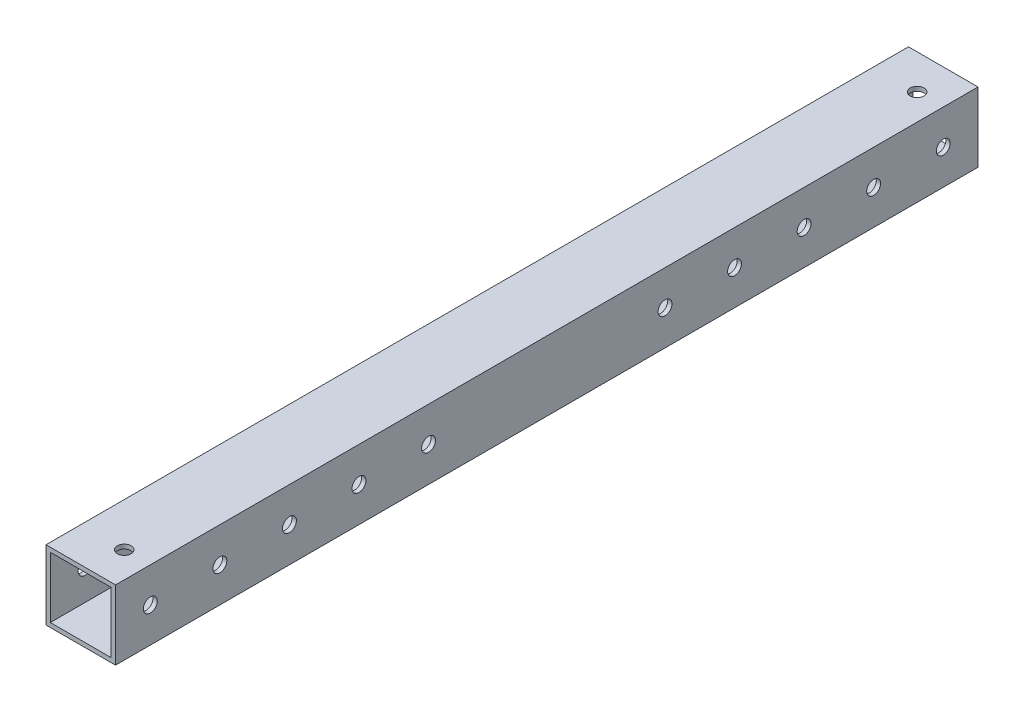
ISO-10303-21;
HEADER;
FILE_DESCRIPTION(('STEP AP214'),'2;1');
FILE_NAME('part.step','',(''),(''),'','','');
FILE_SCHEMA(('AUTOMOTIVE_DESIGN { 1 0 10303 214 1 1 1 1 }'));
ENDSEC;
DATA;
#1=APPLICATION_CONTEXT('core data for automotive mechanical design processes');
#2=APPLICATION_PROTOCOL_DEFINITION('international standard','automotive_design',2000,#1);
#3=PRODUCT_CONTEXT('',#1,'mechanical');
#4=PRODUCT('Part','Part','',(#3));
#5=PRODUCT_RELATED_PRODUCT_CATEGORY('part','',(#4));
#6=PRODUCT_DEFINITION_FORMATION('','',#4);
#7=PRODUCT_DEFINITION_CONTEXT('part definition',#1,'design');
#8=PRODUCT_DEFINITION('design','',#6,#7);
#9=PRODUCT_DEFINITION_SHAPE('','',#8);
#10=(LENGTH_UNIT() NAMED_UNIT(*) SI_UNIT(.MILLI.,.METRE.));
#11=(NAMED_UNIT(*) PLANE_ANGLE_UNIT() SI_UNIT($,.RADIAN.));
#12=(NAMED_UNIT(*) SI_UNIT($,.STERADIAN.) SOLID_ANGLE_UNIT());
#13=UNCERTAINTY_MEASURE_WITH_UNIT(LENGTH_MEASURE(1.E-05),#10,'distance_accuracy_value','');
#14=(GEOMETRIC_REPRESENTATION_CONTEXT(3) GLOBAL_UNCERTAINTY_ASSIGNED_CONTEXT((#13)) GLOBAL_UNIT_ASSIGNED_CONTEXT((#10,
#11,#12)) REPRESENTATION_CONTEXT('',''));
#15=CARTESIAN_POINT('',(0.,0.,0.));
#16=DIRECTION('',(0.,0.,1.));
#17=DIRECTION('',(1.,0.,0.));
#18=AXIS2_PLACEMENT_3D('',#15,#16,#17);
#19=CARTESIAN_POINT('',(0.,0.,314.96));
#20=DIRECTION('',(0.,0.,-1.));
#21=DIRECTION('',(-1.,0.,0.));
#22=AXIS2_PLACEMENT_3D('',#19,#20,#21);
#23=PLANE('',#22);
#24=DIRECTION('',(0.,-1.,0.));
#25=VECTOR('',#24,1.);
#26=CARTESIAN_POINT('',(0.,0.,314.96));
#27=LINE('',#26,#25);
#28=CARTESIAN_POINT('',(0.,25.4,314.96));
#29=VERTEX_POINT('',#28);
#30=CARTESIAN_POINT('',(0.,0.,314.96));
#31=VERTEX_POINT('',#30);
#32=EDGE_CURVE('E139',#29,#31,#27,.T.);
#33=ORIENTED_EDGE('',*,*,#32,.T.);
#34=DIRECTION('',(1.,0.,0.));
#35=VECTOR('',#34,1.);
#36=CARTESIAN_POINT('',(0.,0.,314.96));
#37=LINE('',#36,#35);
#38=CARTESIAN_POINT('',(25.4,0.,314.96));
#39=VERTEX_POINT('',#38);
#40=EDGE_CURVE('E142',#31,#39,#37,.T.);
#41=ORIENTED_EDGE('',*,*,#40,.T.);
#42=DIRECTION('',(0.,1.,0.));
#43=VECTOR('',#42,1.);
#44=CARTESIAN_POINT('',(25.4,0.,314.96));
#45=LINE('',#44,#43);
#46=CARTESIAN_POINT('',(25.4,25.4,314.96));
#47=VERTEX_POINT('',#46);
#48=EDGE_CURVE('E145',#39,#47,#45,.T.);
#49=ORIENTED_EDGE('',*,*,#48,.T.);
#50=DIRECTION('',(-1.,0.,0.));
#51=VECTOR('',#50,1.);
#52=CARTESIAN_POINT('',(0.,25.4,314.96));
#53=LINE('',#52,#51);
#54=EDGE_CURVE('E147',#47,#29,#53,.T.);
#55=ORIENTED_EDGE('',*,*,#54,.T.);
#56=EDGE_LOOP('',(#33,#41,#49,#55));
#57=FACE_BOUND('',#56,.T.);
#58=DIRECTION('',(0.,-1.,0.));
#59=VECTOR('',#58,1.);
#60=CARTESIAN_POINT('',(1.5875,1.5875,314.96));
#61=LINE('',#60,#59);
#62=CARTESIAN_POINT('',(1.5875,23.8125,314.96));
#63=VERTEX_POINT('',#62);
#64=CARTESIAN_POINT('',(1.5875,1.5875,314.96));
#65=VERTEX_POINT('',#64);
#66=EDGE_CURVE('E101',#63,#65,#61,.T.);
#67=ORIENTED_EDGE('',*,*,#66,.F.);
#68=DIRECTION('',(-1.,0.,0.));
#69=VECTOR('',#68,1.);
#70=CARTESIAN_POINT('',(1.5875,23.8125,314.96));
#71=LINE('',#70,#69);
#72=CARTESIAN_POINT('',(23.8125,23.8125,314.96));
#73=VERTEX_POINT('',#72);
#74=EDGE_CURVE('E123',#73,#63,#71,.T.);
#75=ORIENTED_EDGE('',*,*,#74,.F.);
#76=DIRECTION('',(0.,1.,0.));
#77=VECTOR('',#76,1.);
#78=CARTESIAN_POINT('',(23.8125,1.5875,314.96));
#79=LINE('',#78,#77);
#80=CARTESIAN_POINT('',(23.8125,1.5875,314.96));
#81=VERTEX_POINT('',#80);
#82=EDGE_CURVE('E121',#81,#73,#79,.T.);
#83=ORIENTED_EDGE('',*,*,#82,.F.);
#84=DIRECTION('',(1.,0.,0.));
#85=VECTOR('',#84,1.);
#86=CARTESIAN_POINT('',(1.5875,1.5875,314.96));
#87=LINE('',#86,#85);
#88=EDGE_CURVE('E109',#65,#81,#87,.T.);
#89=ORIENTED_EDGE('',*,*,#88,.F.);
#90=EDGE_LOOP('',(#67,#75,#83,#89));
#91=FACE_BOUND('',#90,.T.);
#92=ADVANCED_FACE('F34',(#57,#91),#23,.F.);
#93=CARTESIAN_POINT('',(0.,0.,0.));
#94=DIRECTION('',(0.,0.,-1.));
#95=DIRECTION('',(-1.,0.,0.));
#96=AXIS2_PLACEMENT_3D('',#93,#94,#95);
#97=PLANE('',#96);
#98=DIRECTION('',(0.,-1.,0.));
#99=VECTOR('',#98,1.);
#100=CARTESIAN_POINT('',(0.,0.,0.));
#101=LINE('',#100,#99);
#102=CARTESIAN_POINT('',(0.,25.4,0.));
#103=VERTEX_POINT('',#102);
#104=CARTESIAN_POINT('',(0.,0.,0.));
#105=VERTEX_POINT('',#104);
#106=EDGE_CURVE('E117',#103,#105,#101,.T.);
#107=ORIENTED_EDGE('',*,*,#106,.F.);
#108=DIRECTION('',(-1.,0.,0.));
#109=VECTOR('',#108,1.);
#110=CARTESIAN_POINT('',(0.,25.4,0.));
#111=LINE('',#110,#109);
#112=CARTESIAN_POINT('',(25.4,25.4,0.));
#113=VERTEX_POINT('',#112);
#114=EDGE_CURVE('E143',#113,#103,#111,.T.);
#115=ORIENTED_EDGE('',*,*,#114,.F.);
#116=DIRECTION('',(0.,1.,0.));
#117=VECTOR('',#116,1.);
#118=CARTESIAN_POINT('',(25.4,0.,0.));
#119=LINE('',#118,#117);
#120=CARTESIAN_POINT('',(25.4,0.,0.));
#121=VERTEX_POINT('',#120);
#122=EDGE_CURVE('E154',#121,#113,#119,.T.);
#123=ORIENTED_EDGE('',*,*,#122,.F.);
#124=DIRECTION('',(1.,0.,0.));
#125=VECTOR('',#124,1.);
#126=CARTESIAN_POINT('',(0.,0.,0.));
#127=LINE('',#126,#125);
#128=EDGE_CURVE('E152',#105,#121,#127,.T.);
#129=ORIENTED_EDGE('',*,*,#128,.F.);
#130=EDGE_LOOP('',(#107,#115,#123,#129));
#131=FACE_BOUND('',#130,.T.);
#132=DIRECTION('',(-1.,0.,0.));
#133=VECTOR('',#132,1.);
#134=CARTESIAN_POINT('',(1.5875,23.8125,0.));
#135=LINE('',#134,#133);
#136=CARTESIAN_POINT('',(23.8125,23.8125,0.));
#137=VERTEX_POINT('',#136);
#138=CARTESIAN_POINT('',(1.5875,23.8125,0.));
#139=VERTEX_POINT('',#138);
#140=EDGE_CURVE('E110',#137,#139,#135,.T.);
#141=ORIENTED_EDGE('',*,*,#140,.T.);
#142=DIRECTION('',(0.,-1.,0.));
#143=VECTOR('',#142,1.);
#144=CARTESIAN_POINT('',(1.5875,1.5875,0.));
#145=LINE('',#144,#143);
#146=CARTESIAN_POINT('',(1.5875,1.5875,0.));
#147=VERTEX_POINT('',#146);
#148=EDGE_CURVE('E59',#139,#147,#145,.T.);
#149=ORIENTED_EDGE('',*,*,#148,.T.);
#150=DIRECTION('',(1.,0.,0.));
#151=VECTOR('',#150,1.);
#152=CARTESIAN_POINT('',(1.5875,1.5875,0.));
#153=LINE('',#152,#151);
#154=CARTESIAN_POINT('',(23.8125,1.5875,0.));
#155=VERTEX_POINT('',#154);
#156=EDGE_CURVE('E116',#147,#155,#153,.T.);
#157=ORIENTED_EDGE('',*,*,#156,.T.);
#158=DIRECTION('',(0.,1.,0.));
#159=VECTOR('',#158,1.);
#160=CARTESIAN_POINT('',(23.8125,1.5875,0.));
#161=LINE('',#160,#159);
#162=EDGE_CURVE('E131',#155,#137,#161,.T.);
#163=ORIENTED_EDGE('',*,*,#162,.T.);
#164=EDGE_LOOP('',(#141,#149,#157,#163));
#165=FACE_BOUND('',#164,.T.);
#166=ADVANCED_FACE('F267',(#131,#165),#97,.T.);
#167=CARTESIAN_POINT('',(0.,0.,314.96));
#168=DIRECTION('',(1.,0.,0.));
#169=DIRECTION('',(0.,0.,-1.));
#170=AXIS2_PLACEMENT_3D('',#167,#168,#169);
#171=PLANE('',#170);
#172=CARTESIAN_POINT('',(0.,12.7,302.26));
#173=DIRECTION('',(1.,0.,0.));
#174=DIRECTION('',(0.,0.,-1.));
#175=AXIS2_PLACEMENT_3D('',#172,#173,#174);
#176=CIRCLE('',#175,2.54000000000001);
#177=CARTESIAN_POINT('',(0.,12.7,299.72));
#178=VERTEX_POINT('',#177);
#179=EDGE_CURVE('E176',#178,#178,#176,.T.);
#180=ORIENTED_EDGE('',*,*,#179,.T.);
#181=EDGE_LOOP('',(#180));
#182=FACE_BOUND('',#181,.T.);
#183=CARTESIAN_POINT('',(0.,12.7,276.86));
#184=DIRECTION('',(1.,0.,0.));
#185=DIRECTION('',(0.,0.,-1.));
#186=AXIS2_PLACEMENT_3D('',#183,#184,#185);
#187=CIRCLE('',#186,2.54000000000001);
#188=CARTESIAN_POINT('',(0.,12.7,274.32));
#189=VERTEX_POINT('',#188);
#190=EDGE_CURVE('E384',#189,#189,#187,.T.);
#191=ORIENTED_EDGE('',*,*,#190,.T.);
#192=EDGE_LOOP('',(#191));
#193=FACE_BOUND('',#192,.T.);
#194=CARTESIAN_POINT('',(0.,12.7,251.46));
#195=DIRECTION('',(1.,0.,0.));
#196=DIRECTION('',(0.,0.,-1.));
#197=AXIS2_PLACEMENT_3D('',#194,#195,#196);
#198=CIRCLE('',#197,2.53999999999995);
#199=CARTESIAN_POINT('',(0.,12.7,248.92));
#200=VERTEX_POINT('',#199);
#201=EDGE_CURVE('E388',#200,#200,#198,.T.);
#202=ORIENTED_EDGE('',*,*,#201,.T.);
#203=EDGE_LOOP('',(#202));
#204=FACE_BOUND('',#203,.T.);
#205=CARTESIAN_POINT('',(0.,12.7,226.06));
#206=DIRECTION('',(1.,0.,0.));
#207=DIRECTION('',(0.,0.,-1.));
#208=AXIS2_PLACEMENT_3D('',#205,#206,#207);
#209=CIRCLE('',#208,2.53999999999998);
#210=CARTESIAN_POINT('',(0.,12.7,223.52));
#211=VERTEX_POINT('',#210);
#212=EDGE_CURVE('E392',#211,#211,#209,.T.);
#213=ORIENTED_EDGE('',*,*,#212,.T.);
#214=EDGE_LOOP('',(#213));
#215=FACE_BOUND('',#214,.T.);
#216=CARTESIAN_POINT('',(0.,12.7,200.66));
#217=DIRECTION('',(1.,0.,0.));
#218=DIRECTION('',(0.,0.,-1.));
#219=AXIS2_PLACEMENT_3D('',#216,#217,#218);
#220=CIRCLE('',#219,2.53999999999998);
#221=CARTESIAN_POINT('',(0.,12.7,198.12));
#222=VERTEX_POINT('',#221);
#223=EDGE_CURVE('E396',#222,#222,#220,.T.);
#224=ORIENTED_EDGE('',*,*,#223,.T.);
#225=EDGE_LOOP('',(#224));
#226=FACE_BOUND('',#225,.T.);
#227=CARTESIAN_POINT('',(0.,12.7,114.3));
#228=DIRECTION('',(1.,0.,0.));
#229=DIRECTION('',(0.,0.,1.));
#230=AXIS2_PLACEMENT_3D('',#227,#228,#229);
#231=CIRCLE('',#230,2.53999999999998);
#232=CARTESIAN_POINT('',(0.,12.7,116.84));
#233=VERTEX_POINT('',#232);
#234=EDGE_CURVE('E400',#233,#233,#231,.T.);
#235=ORIENTED_EDGE('',*,*,#234,.T.);
#236=EDGE_LOOP('',(#235));
#237=FACE_BOUND('',#236,.T.);
#238=CARTESIAN_POINT('',(0.,12.7,88.9));
#239=DIRECTION('',(1.,0.,0.));
#240=DIRECTION('',(0.,0.,1.));
#241=AXIS2_PLACEMENT_3D('',#238,#239,#240);
#242=CIRCLE('',#241,2.53999999999998);
#243=CARTESIAN_POINT('',(0.,12.7,91.44));
#244=VERTEX_POINT('',#243);
#245=EDGE_CURVE('E404',#244,#244,#242,.T.);
#246=ORIENTED_EDGE('',*,*,#245,.T.);
#247=EDGE_LOOP('',(#246));
#248=FACE_BOUND('',#247,.T.);
#249=CARTESIAN_POINT('',(0.,12.7,63.5));
#250=DIRECTION('',(1.,0.,0.));
#251=DIRECTION('',(0.,0.,1.));
#252=AXIS2_PLACEMENT_3D('',#249,#250,#251);
#253=CIRCLE('',#252,2.53999999999996);
#254=CARTESIAN_POINT('',(0.,12.7,66.04));
#255=VERTEX_POINT('',#254);
#256=EDGE_CURVE('E408',#255,#255,#253,.T.);
#257=ORIENTED_EDGE('',*,*,#256,.T.);
#258=EDGE_LOOP('',(#257));
#259=FACE_BOUND('',#258,.T.);
#260=CARTESIAN_POINT('',(0.,12.7,38.1));
#261=DIRECTION('',(1.,0.,0.));
#262=DIRECTION('',(0.,0.,1.));
#263=AXIS2_PLACEMENT_3D('',#260,#261,#262);
#264=CIRCLE('',#263,2.53999999999998);
#265=CARTESIAN_POINT('',(0.,12.7,40.64));
#266=VERTEX_POINT('',#265);
#267=EDGE_CURVE('E411',#266,#266,#264,.T.);
#268=ORIENTED_EDGE('',*,*,#267,.T.);
#269=EDGE_LOOP('',(#268));
#270=FACE_BOUND('',#269,.T.);
#271=CARTESIAN_POINT('',(0.,12.7,12.7));
#272=DIRECTION('',(1.,0.,0.));
#273=DIRECTION('',(0.,0.,1.));
#274=AXIS2_PLACEMENT_3D('',#271,#272,#273);
#275=CIRCLE('',#274,2.53999999999998);
#276=CARTESIAN_POINT('',(0.,12.7,15.24));
#277=VERTEX_POINT('',#276);
#278=EDGE_CURVE('E331',#277,#277,#275,.T.);
#279=ORIENTED_EDGE('',*,*,#278,.T.);
#280=EDGE_LOOP('',(#279));
#281=FACE_BOUND('',#280,.T.);
#282=ORIENTED_EDGE('',*,*,#106,.T.);
#283=DIRECTION('',(0.,0.,-1.));
#284=VECTOR('',#283,1.);
#285=CARTESIAN_POINT('',(0.,0.,314.96));
#286=LINE('',#285,#284);
#287=EDGE_CURVE('E11',#31,#105,#286,.T.);
#288=ORIENTED_EDGE('',*,*,#287,.F.);
#289=ORIENTED_EDGE('',*,*,#32,.F.);
#290=DIRECTION('',(0.,0.,-1.));
#291=VECTOR('',#290,1.);
#292=CARTESIAN_POINT('',(0.,25.4,314.96));
#293=LINE('',#292,#291);
#294=EDGE_CURVE('E149',#29,#103,#293,.T.);
#295=ORIENTED_EDGE('',*,*,#294,.T.);
#296=EDGE_LOOP('',(#282,#288,#289,#295));
#297=FACE_BOUND('',#296,.T.);
#298=ADVANCED_FACE('F36',(#182,#193,#204,#215,#226,#237,#248,#259,#270,#281,#297),#171,.F.);
#299=CARTESIAN_POINT('',(0.,0.,314.96));
#300=DIRECTION('',(0.,1.,0.));
#301=DIRECTION('',(0.,0.,1.));
#302=AXIS2_PLACEMENT_3D('',#299,#300,#301);
#303=PLANE('',#302);
#304=CARTESIAN_POINT('',(15.875,0.,302.26));
#305=DIRECTION('',(0.,1.,0.));
#306=DIRECTION('',(0.,0.,1.));
#307=AXIS2_PLACEMENT_3D('',#304,#305,#306);
#308=CIRCLE('',#307,2.53999999999997);
#309=CARTESIAN_POINT('',(15.875,0.,304.8));
#310=VERTEX_POINT('',#309);
#311=EDGE_CURVE('E168',#310,#310,#308,.T.);
#312=ORIENTED_EDGE('',*,*,#311,.T.);
#313=EDGE_LOOP('',(#312));
#314=FACE_BOUND('',#313,.T.);
#315=CARTESIAN_POINT('',(15.875,0.,12.7));
#316=DIRECTION('',(0.,1.,0.));
#317=DIRECTION('',(0.,0.,1.));
#318=AXIS2_PLACEMENT_3D('',#315,#316,#317);
#319=CIRCLE('',#318,2.54);
#320=CARTESIAN_POINT('',(15.875,0.,15.24));
#321=VERTEX_POINT('',#320);
#322=EDGE_CURVE('E227',#321,#321,#319,.T.);
#323=ORIENTED_EDGE('',*,*,#322,.T.);
#324=EDGE_LOOP('',(#323));
#325=FACE_BOUND('',#324,.T.);
#326=ORIENTED_EDGE('',*,*,#128,.T.);
#327=DIRECTION('',(0.,0.,-1.));
#328=VECTOR('',#327,1.);
#329=CARTESIAN_POINT('',(25.4,0.,314.96));
#330=LINE('',#329,#328);
#331=EDGE_CURVE('E43',#39,#121,#330,.T.);
#332=ORIENTED_EDGE('',*,*,#331,.F.);
#333=ORIENTED_EDGE('',*,*,#40,.F.);
#334=ORIENTED_EDGE('',*,*,#287,.T.);
#335=EDGE_LOOP('',(#326,#332,#333,#334));
#336=FACE_BOUND('',#335,.T.);
#337=ADVANCED_FACE('F253',(#314,#325,#336),#303,.F.);
#338=CARTESIAN_POINT('',(25.4,0.,314.96));
#339=DIRECTION('',(-1.,0.,0.));
#340=DIRECTION('',(0.,0.,1.));
#341=AXIS2_PLACEMENT_3D('',#338,#339,#340);
#342=PLANE('',#341);
#343=CARTESIAN_POINT('',(25.4,12.7,302.26));
#344=DIRECTION('',(1.,0.,0.));
#345=DIRECTION('',(0.,0.,-1.));
#346=AXIS2_PLACEMENT_3D('',#343,#344,#345);
#347=CIRCLE('',#346,2.54000000000001);
#348=CARTESIAN_POINT('',(25.4,12.7,299.72));
#349=VERTEX_POINT('',#348);
#350=EDGE_CURVE('E294',#349,#349,#347,.T.);
#351=ORIENTED_EDGE('',*,*,#350,.F.);
#352=EDGE_LOOP('',(#351));
#353=FACE_BOUND('',#352,.T.);
#354=CARTESIAN_POINT('',(25.4,12.7,276.86));
#355=DIRECTION('',(1.,0.,0.));
#356=DIRECTION('',(0.,0.,-1.));
#357=AXIS2_PLACEMENT_3D('',#354,#355,#356);
#358=CIRCLE('',#357,2.54000000000001);
#359=CARTESIAN_POINT('',(25.4,12.7,274.32));
#360=VERTEX_POINT('',#359);
#361=EDGE_CURVE('E298',#360,#360,#358,.T.);
#362=ORIENTED_EDGE('',*,*,#361,.F.);
#363=EDGE_LOOP('',(#362));
#364=FACE_BOUND('',#363,.T.);
#365=CARTESIAN_POINT('',(25.4,12.7,251.46));
#366=DIRECTION('',(1.,0.,0.));
#367=DIRECTION('',(0.,0.,-1.));
#368=AXIS2_PLACEMENT_3D('',#365,#366,#367);
#369=CIRCLE('',#368,2.53999999999995);
#370=CARTESIAN_POINT('',(25.4,12.7,248.92));
#371=VERTEX_POINT('',#370);
#372=EDGE_CURVE('E302',#371,#371,#369,.T.);
#373=ORIENTED_EDGE('',*,*,#372,.F.);
#374=EDGE_LOOP('',(#373));
#375=FACE_BOUND('',#374,.T.);
#376=CARTESIAN_POINT('',(25.4,12.7,226.06));
#377=DIRECTION('',(1.,0.,0.));
#378=DIRECTION('',(0.,0.,-1.));
#379=AXIS2_PLACEMENT_3D('',#376,#377,#378);
#380=CIRCLE('',#379,2.53999999999998);
#381=CARTESIAN_POINT('',(25.4,12.7,223.52));
#382=VERTEX_POINT('',#381);
#383=EDGE_CURVE('E306',#382,#382,#380,.T.);
#384=ORIENTED_EDGE('',*,*,#383,.F.);
#385=EDGE_LOOP('',(#384));
#386=FACE_BOUND('',#385,.T.);
#387=CARTESIAN_POINT('',(25.4,12.7,200.66));
#388=DIRECTION('',(1.,0.,0.));
#389=DIRECTION('',(0.,0.,-1.));
#390=AXIS2_PLACEMENT_3D('',#387,#388,#389);
#391=CIRCLE('',#390,2.53999999999998);
#392=CARTESIAN_POINT('',(25.4,12.7,198.12));
#393=VERTEX_POINT('',#392);
#394=EDGE_CURVE('E310',#393,#393,#391,.T.);
#395=ORIENTED_EDGE('',*,*,#394,.F.);
#396=EDGE_LOOP('',(#395));
#397=FACE_BOUND('',#396,.T.);
#398=CARTESIAN_POINT('',(25.4,12.7,114.3));
#399=DIRECTION('',(1.,0.,0.));
#400=DIRECTION('',(0.,0.,1.));
#401=AXIS2_PLACEMENT_3D('',#398,#399,#400);
#402=CIRCLE('',#401,2.53999999999998);
#403=CARTESIAN_POINT('',(25.4,12.7,116.84));
#404=VERTEX_POINT('',#403);
#405=EDGE_CURVE('E314',#404,#404,#402,.T.);
#406=ORIENTED_EDGE('',*,*,#405,.F.);
#407=EDGE_LOOP('',(#406));
#408=FACE_BOUND('',#407,.T.);
#409=CARTESIAN_POINT('',(25.4,12.7,88.9));
#410=DIRECTION('',(1.,0.,0.));
#411=DIRECTION('',(0.,0.,1.));
#412=AXIS2_PLACEMENT_3D('',#409,#410,#411);
#413=CIRCLE('',#412,2.53999999999998);
#414=CARTESIAN_POINT('',(25.4,12.7,91.44));
#415=VERTEX_POINT('',#414);
#416=EDGE_CURVE('E318',#415,#415,#413,.T.);
#417=ORIENTED_EDGE('',*,*,#416,.F.);
#418=EDGE_LOOP('',(#417));
#419=FACE_BOUND('',#418,.T.);
#420=CARTESIAN_POINT('',(25.4,12.7,63.5));
#421=DIRECTION('',(1.,0.,0.));
#422=DIRECTION('',(0.,0.,1.));
#423=AXIS2_PLACEMENT_3D('',#420,#421,#422);
#424=CIRCLE('',#423,2.53999999999996);
#425=CARTESIAN_POINT('',(25.4,12.7,66.04));
#426=VERTEX_POINT('',#425);
#427=EDGE_CURVE('E322',#426,#426,#424,.T.);
#428=ORIENTED_EDGE('',*,*,#427,.F.);
#429=EDGE_LOOP('',(#428));
#430=FACE_BOUND('',#429,.T.);
#431=CARTESIAN_POINT('',(25.4,12.7,38.1));
#432=DIRECTION('',(1.,0.,0.));
#433=DIRECTION('',(0.,0.,1.));
#434=AXIS2_PLACEMENT_3D('',#431,#432,#433);
#435=CIRCLE('',#434,2.53999999999998);
#436=CARTESIAN_POINT('',(25.4,12.7,40.64));
#437=VERTEX_POINT('',#436);
#438=EDGE_CURVE('E326',#437,#437,#435,.T.);
#439=ORIENTED_EDGE('',*,*,#438,.F.);
#440=EDGE_LOOP('',(#439));
#441=FACE_BOUND('',#440,.T.);
#442=CARTESIAN_POINT('',(25.4,12.7,12.7));
#443=DIRECTION('',(1.,0.,0.));
#444=DIRECTION('',(0.,0.,1.));
#445=AXIS2_PLACEMENT_3D('',#442,#443,#444);
#446=CIRCLE('',#445,2.53999999999998);
#447=CARTESIAN_POINT('',(25.4,12.7,15.24));
#448=VERTEX_POINT('',#447);
#449=EDGE_CURVE('E329',#448,#448,#446,.T.);
#450=ORIENTED_EDGE('',*,*,#449,.F.);
#451=EDGE_LOOP('',(#450));
#452=FACE_BOUND('',#451,.T.);
#453=ORIENTED_EDGE('',*,*,#122,.T.);
#454=DIRECTION('',(0.,0.,-1.));
#455=VECTOR('',#454,1.);
#456=CARTESIAN_POINT('',(25.4,25.4,314.96));
#457=LINE('',#456,#455);
#458=EDGE_CURVE('E159',#47,#113,#457,.T.);
#459=ORIENTED_EDGE('',*,*,#458,.F.);
#460=ORIENTED_EDGE('',*,*,#48,.F.);
#461=ORIENTED_EDGE('',*,*,#331,.T.);
#462=EDGE_LOOP('',(#453,#459,#460,#461));
#463=FACE_BOUND('',#462,.T.);
#464=ADVANCED_FACE('F256',(#353,#364,#375,#386,#397,#408,#419,#430,#441,#452,#463),#342,.F.);
#465=CARTESIAN_POINT('',(0.,25.4,314.96));
#466=DIRECTION('',(0.,-1.,0.));
#467=DIRECTION('',(0.,0.,-1.));
#468=AXIS2_PLACEMENT_3D('',#465,#466,#467);
#469=PLANE('',#468);
#470=CARTESIAN_POINT('',(15.875,25.4,302.26));
#471=DIRECTION('',(0.,1.,0.));
#472=DIRECTION('',(0.,0.,1.));
#473=AXIS2_PLACEMENT_3D('',#470,#471,#472);
#474=CIRCLE('',#473,2.53999999999997);
#475=CARTESIAN_POINT('',(15.875,25.4,304.8));
#476=VERTEX_POINT('',#475);
#477=EDGE_CURVE('E224',#476,#476,#474,.T.);
#478=ORIENTED_EDGE('',*,*,#477,.F.);
#479=EDGE_LOOP('',(#478));
#480=FACE_BOUND('',#479,.T.);
#481=CARTESIAN_POINT('',(15.875,25.4,12.7));
#482=DIRECTION('',(0.,1.,0.));
#483=DIRECTION('',(0.,0.,1.));
#484=AXIS2_PLACEMENT_3D('',#481,#482,#483);
#485=CIRCLE('',#484,2.54);
#486=CARTESIAN_POINT('',(15.875,25.4,15.24));
#487=VERTEX_POINT('',#486);
#488=EDGE_CURVE('E221',#487,#487,#485,.T.);
#489=ORIENTED_EDGE('',*,*,#488,.F.);
#490=EDGE_LOOP('',(#489));
#491=FACE_BOUND('',#490,.T.);
#492=ORIENTED_EDGE('',*,*,#114,.T.);
#493=ORIENTED_EDGE('',*,*,#294,.F.);
#494=ORIENTED_EDGE('',*,*,#54,.F.);
#495=ORIENTED_EDGE('',*,*,#458,.T.);
#496=EDGE_LOOP('',(#492,#493,#494,#495));
#497=FACE_BOUND('',#496,.T.);
#498=ADVANCED_FACE('F271',(#480,#491,#497),#469,.F.);
#499=CARTESIAN_POINT('',(1.5875,1.5875,314.96));
#500=DIRECTION('',(1.,0.,0.));
#501=DIRECTION('',(0.,0.,-1.));
#502=AXIS2_PLACEMENT_3D('',#499,#500,#501);
#503=PLANE('',#502);
#504=CARTESIAN_POINT('',(1.5875,12.7,302.26));
#505=DIRECTION('',(1.,0.,0.));
#506=DIRECTION('',(0.,0.,-1.));
#507=AXIS2_PLACEMENT_3D('',#504,#505,#506);
#508=CIRCLE('',#507,2.54000000000001);
#509=CARTESIAN_POINT('',(1.5875,12.7,299.72));
#510=VERTEX_POINT('',#509);
#511=EDGE_CURVE('E218',#510,#510,#508,.T.);
#512=ORIENTED_EDGE('',*,*,#511,.F.);
#513=EDGE_LOOP('',(#512));
#514=FACE_BOUND('',#513,.T.);
#515=CARTESIAN_POINT('',(1.5875,12.7,276.86));
#516=DIRECTION('',(1.,0.,0.));
#517=DIRECTION('',(0.,0.,-1.));
#518=AXIS2_PLACEMENT_3D('',#515,#516,#517);
#519=CIRCLE('',#518,2.54000000000001);
#520=CARTESIAN_POINT('',(1.5875,12.7,274.32));
#521=VERTEX_POINT('',#520);
#522=EDGE_CURVE('E206',#521,#521,#519,.T.);
#523=ORIENTED_EDGE('',*,*,#522,.F.);
#524=EDGE_LOOP('',(#523));
#525=FACE_BOUND('',#524,.T.);
#526=CARTESIAN_POINT('',(1.5875,12.7,251.46));
#527=DIRECTION('',(1.,0.,0.));
#528=DIRECTION('',(0.,0.,-1.));
#529=AXIS2_PLACEMENT_3D('',#526,#527,#528);
#530=CIRCLE('',#529,2.53999999999995);
#531=CARTESIAN_POINT('',(1.5875,12.7,248.92));
#532=VERTEX_POINT('',#531);
#533=EDGE_CURVE('E203',#532,#532,#530,.T.);
#534=ORIENTED_EDGE('',*,*,#533,.F.);
#535=EDGE_LOOP('',(#534));
#536=FACE_BOUND('',#535,.T.);
#537=CARTESIAN_POINT('',(1.5875,12.7,226.06));
#538=DIRECTION('',(1.,0.,0.));
#539=DIRECTION('',(0.,0.,-1.));
#540=AXIS2_PLACEMENT_3D('',#537,#538,#539);
#541=CIRCLE('',#540,2.53999999999998);
#542=CARTESIAN_POINT('',(1.5875,12.7,223.52));
#543=VERTEX_POINT('',#542);
#544=EDGE_CURVE('E200',#543,#543,#541,.T.);
#545=ORIENTED_EDGE('',*,*,#544,.F.);
#546=EDGE_LOOP('',(#545));
#547=FACE_BOUND('',#546,.T.);
#548=CARTESIAN_POINT('',(1.5875,12.7,200.66));
#549=DIRECTION('',(1.,0.,0.));
#550=DIRECTION('',(0.,0.,-1.));
#551=AXIS2_PLACEMENT_3D('',#548,#549,#550);
#552=CIRCLE('',#551,2.53999999999998);
#553=CARTESIAN_POINT('',(1.5875,12.7,198.12));
#554=VERTEX_POINT('',#553);
#555=EDGE_CURVE('E196',#554,#554,#552,.T.);
#556=ORIENTED_EDGE('',*,*,#555,.F.);
#557=EDGE_LOOP('',(#556));
#558=FACE_BOUND('',#557,.T.);
#559=CARTESIAN_POINT('',(1.5875,12.7,114.3));
#560=DIRECTION('',(1.,0.,0.));
#561=DIRECTION('',(0.,0.,-1.));
#562=AXIS2_PLACEMENT_3D('',#559,#560,#561);
#563=CIRCLE('',#562,2.53999999999998);
#564=CARTESIAN_POINT('',(1.5875,12.7,111.76));
#565=VERTEX_POINT('',#564);
#566=EDGE_CURVE('E192',#565,#565,#563,.T.);
#567=ORIENTED_EDGE('',*,*,#566,.F.);
#568=EDGE_LOOP('',(#567));
#569=FACE_BOUND('',#568,.T.);
#570=CARTESIAN_POINT('',(1.5875,12.7,88.9));
#571=DIRECTION('',(1.,0.,0.));
#572=DIRECTION('',(0.,0.,-1.));
#573=AXIS2_PLACEMENT_3D('',#570,#571,#572);
#574=CIRCLE('',#573,2.53999999999998);
#575=CARTESIAN_POINT('',(1.5875,12.7,86.36));
#576=VERTEX_POINT('',#575);
#577=EDGE_CURVE('E188',#576,#576,#574,.T.);
#578=ORIENTED_EDGE('',*,*,#577,.F.);
#579=EDGE_LOOP('',(#578));
#580=FACE_BOUND('',#579,.T.);
#581=CARTESIAN_POINT('',(1.5875,12.7,63.5));
#582=DIRECTION('',(1.,0.,0.));
#583=DIRECTION('',(0.,0.,-1.));
#584=AXIS2_PLACEMENT_3D('',#581,#582,#583);
#585=CIRCLE('',#584,2.53999999999996);
#586=CARTESIAN_POINT('',(1.5875,12.7,60.9600000000001));
#587=VERTEX_POINT('',#586);
#588=EDGE_CURVE('E184',#587,#587,#585,.T.);
#589=ORIENTED_EDGE('',*,*,#588,.F.);
#590=EDGE_LOOP('',(#589));
#591=FACE_BOUND('',#590,.T.);
#592=CARTESIAN_POINT('',(1.5875,12.7,38.1));
#593=DIRECTION('',(1.,0.,0.));
#594=DIRECTION('',(0.,0.,-1.));
#595=AXIS2_PLACEMENT_3D('',#592,#593,#594);
#596=CIRCLE('',#595,2.53999999999998);
#597=CARTESIAN_POINT('',(1.5875,12.7,35.56));
#598=VERTEX_POINT('',#597);
#599=EDGE_CURVE('E180',#598,#598,#596,.T.);
#600=ORIENTED_EDGE('',*,*,#599,.F.);
#601=EDGE_LOOP('',(#600));
#602=FACE_BOUND('',#601,.T.);
#603=CARTESIAN_POINT('',(1.5875,12.7,12.7));
#604=DIRECTION('',(1.,0.,0.));
#605=DIRECTION('',(0.,0.,-1.));
#606=AXIS2_PLACEMENT_3D('',#603,#604,#605);
#607=CIRCLE('',#606,2.53999999999998);
#608=CARTESIAN_POINT('',(1.5875,12.7,10.16));
#609=VERTEX_POINT('',#608);
#610=EDGE_CURVE('E175',#609,#609,#607,.T.);
#611=ORIENTED_EDGE('',*,*,#610,.F.);
#612=EDGE_LOOP('',(#611));
#613=FACE_BOUND('',#612,.T.);
#614=ORIENTED_EDGE('',*,*,#148,.F.);
#615=DIRECTION('',(0.,0.,-1.));
#616=VECTOR('',#615,1.);
#617=CARTESIAN_POINT('',(1.5875,23.8125,314.96));
#618=LINE('',#617,#616);
#619=EDGE_CURVE('E105',#63,#139,#618,.T.);
#620=ORIENTED_EDGE('',*,*,#619,.F.);
#621=ORIENTED_EDGE('',*,*,#66,.T.);
#622=DIRECTION('',(0.,0.,-1.));
#623=VECTOR('',#622,1.);
#624=CARTESIAN_POINT('',(1.5875,1.5875,314.96));
#625=LINE('',#624,#623);
#626=EDGE_CURVE('E104',#65,#147,#625,.T.);
#627=ORIENTED_EDGE('',*,*,#626,.T.);
#628=EDGE_LOOP('',(#614,#620,#621,#627));
#629=FACE_BOUND('',#628,.T.);
#630=ADVANCED_FACE('F103',(#514,#525,#536,#547,#558,#569,#580,#591,#602,#613,#629),#503,.T.);
#631=CARTESIAN_POINT('',(1.5875,1.5875,314.96));
#632=DIRECTION('',(0.,1.,0.));
#633=DIRECTION('',(0.,0.,1.));
#634=AXIS2_PLACEMENT_3D('',#631,#632,#633);
#635=PLANE('',#634);
#636=CARTESIAN_POINT('',(15.875,1.5875,302.26));
#637=DIRECTION('',(0.,1.,0.));
#638=DIRECTION('',(0.,0.,1.));
#639=AXIS2_PLACEMENT_3D('',#636,#637,#638);
#640=CIRCLE('',#639,2.53999999999997);
#641=CARTESIAN_POINT('',(15.875,1.5875,304.8));
#642=VERTEX_POINT('',#641);
#643=EDGE_CURVE('E129',#642,#642,#640,.T.);
#644=ORIENTED_EDGE('',*,*,#643,.F.);
#645=EDGE_LOOP('',(#644));
#646=FACE_BOUND('',#645,.T.);
#647=CARTESIAN_POINT('',(15.875,1.5875,12.7));
#648=DIRECTION('',(0.,1.,0.));
#649=DIRECTION('',(0.,0.,1.));
#650=AXIS2_PLACEMENT_3D('',#647,#648,#649);
#651=CIRCLE('',#650,2.54);
#652=CARTESIAN_POINT('',(15.875,1.5875,15.24));
#653=VERTEX_POINT('',#652);
#654=EDGE_CURVE('E167',#653,#653,#651,.T.);
#655=ORIENTED_EDGE('',*,*,#654,.F.);
#656=EDGE_LOOP('',(#655));
#657=FACE_BOUND('',#656,.T.);
#658=ORIENTED_EDGE('',*,*,#156,.F.);
#659=ORIENTED_EDGE('',*,*,#626,.F.);
#660=ORIENTED_EDGE('',*,*,#88,.T.);
#661=DIRECTION('',(0.,0.,-1.));
#662=VECTOR('',#661,1.);
#663=CARTESIAN_POINT('',(23.8125,1.5875,314.96));
#664=LINE('',#663,#662);
#665=EDGE_CURVE('E118',#81,#155,#664,.T.);
#666=ORIENTED_EDGE('',*,*,#665,.T.);
#667=EDGE_LOOP('',(#658,#659,#660,#666));
#668=FACE_BOUND('',#667,.T.);
#669=ADVANCED_FACE('F113',(#646,#657,#668),#635,.T.);
#670=CARTESIAN_POINT('',(23.8125,1.5875,314.96));
#671=DIRECTION('',(-1.,0.,0.));
#672=DIRECTION('',(0.,0.,1.));
#673=AXIS2_PLACEMENT_3D('',#670,#671,#672);
#674=PLANE('',#673);
#675=CARTESIAN_POINT('',(23.8125,12.7,302.26));
#676=DIRECTION('',(-1.,0.,0.));
#677=DIRECTION('',(0.,0.,1.));
#678=AXIS2_PLACEMENT_3D('',#675,#676,#677);
#679=CIRCLE('',#678,2.54000000000001);
#680=CARTESIAN_POINT('',(23.8125,12.7,304.8));
#681=VERTEX_POINT('',#680);
#682=EDGE_CURVE('E38',#681,#681,#679,.T.);
#683=ORIENTED_EDGE('',*,*,#682,.F.);
#684=EDGE_LOOP('',(#683));
#685=FACE_BOUND('',#684,.T.);
#686=CARTESIAN_POINT('',(23.8125,12.7,276.86));
#687=DIRECTION('',(-1.,0.,0.));
#688=DIRECTION('',(0.,0.,1.));
#689=AXIS2_PLACEMENT_3D('',#686,#687,#688);
#690=CIRCLE('',#689,2.54000000000001);
#691=CARTESIAN_POINT('',(23.8125,12.7,279.4));
#692=VERTEX_POINT('',#691);
#693=EDGE_CURVE('E204',#692,#692,#690,.T.);
#694=ORIENTED_EDGE('',*,*,#693,.F.);
#695=EDGE_LOOP('',(#694));
#696=FACE_BOUND('',#695,.T.);
#697=CARTESIAN_POINT('',(23.8125,12.7,251.46));
#698=DIRECTION('',(-1.,0.,0.));
#699=DIRECTION('',(0.,0.,1.));
#700=AXIS2_PLACEMENT_3D('',#697,#698,#699);
#701=CIRCLE('',#700,2.53999999999995);
#702=CARTESIAN_POINT('',(23.8125,12.7,254.));
#703=VERTEX_POINT('',#702);
#704=EDGE_CURVE('E201',#703,#703,#701,.T.);
#705=ORIENTED_EDGE('',*,*,#704,.F.);
#706=EDGE_LOOP('',(#705));
#707=FACE_BOUND('',#706,.T.);
#708=CARTESIAN_POINT('',(23.8125,12.7,226.06));
#709=DIRECTION('',(-1.,0.,0.));
#710=DIRECTION('',(0.,0.,1.));
#711=AXIS2_PLACEMENT_3D('',#708,#709,#710);
#712=CIRCLE('',#711,2.53999999999998);
#713=CARTESIAN_POINT('',(23.8125,12.7,228.6));
#714=VERTEX_POINT('',#713);
#715=EDGE_CURVE('E197',#714,#714,#712,.T.);
#716=ORIENTED_EDGE('',*,*,#715,.F.);
#717=EDGE_LOOP('',(#716));
#718=FACE_BOUND('',#717,.T.);
#719=CARTESIAN_POINT('',(23.8125,12.7,200.66));
#720=DIRECTION('',(-1.,0.,0.));
#721=DIRECTION('',(0.,0.,1.));
#722=AXIS2_PLACEMENT_3D('',#719,#720,#721);
#723=CIRCLE('',#722,2.53999999999998);
#724=CARTESIAN_POINT('',(23.8125,12.7,203.2));
#725=VERTEX_POINT('',#724);
#726=EDGE_CURVE('E193',#725,#725,#723,.T.);
#727=ORIENTED_EDGE('',*,*,#726,.F.);
#728=EDGE_LOOP('',(#727));
#729=FACE_BOUND('',#728,.T.);
#730=CARTESIAN_POINT('',(23.8125,12.7,114.3));
#731=DIRECTION('',(-1.,0.,0.));
#732=DIRECTION('',(0.,0.,1.));
#733=AXIS2_PLACEMENT_3D('',#730,#731,#732);
#734=CIRCLE('',#733,2.53999999999998);
#735=CARTESIAN_POINT('',(23.8125,12.7,116.84));
#736=VERTEX_POINT('',#735);
#737=EDGE_CURVE('E189',#736,#736,#734,.T.);
#738=ORIENTED_EDGE('',*,*,#737,.F.);
#739=EDGE_LOOP('',(#738));
#740=FACE_BOUND('',#739,.T.);
#741=CARTESIAN_POINT('',(23.8125,12.7,88.9));
#742=DIRECTION('',(-1.,0.,0.));
#743=DIRECTION('',(0.,0.,1.));
#744=AXIS2_PLACEMENT_3D('',#741,#742,#743);
#745=CIRCLE('',#744,2.53999999999998);
#746=CARTESIAN_POINT('',(23.8125,12.7,91.44));
#747=VERTEX_POINT('',#746);
#748=EDGE_CURVE('E185',#747,#747,#745,.T.);
#749=ORIENTED_EDGE('',*,*,#748,.F.);
#750=EDGE_LOOP('',(#749));
#751=FACE_BOUND('',#750,.T.);
#752=CARTESIAN_POINT('',(23.8125,12.7,63.5));
#753=DIRECTION('',(-1.,0.,0.));
#754=DIRECTION('',(0.,0.,1.));
#755=AXIS2_PLACEMENT_3D('',#752,#753,#754);
#756=CIRCLE('',#755,2.53999999999996);
#757=CARTESIAN_POINT('',(23.8125,12.7,66.04));
#758=VERTEX_POINT('',#757);
#759=EDGE_CURVE('E181',#758,#758,#756,.T.);
#760=ORIENTED_EDGE('',*,*,#759,.F.);
#761=EDGE_LOOP('',(#760));
#762=FACE_BOUND('',#761,.T.);
#763=CARTESIAN_POINT('',(23.8125,12.7,38.1));
#764=DIRECTION('',(-1.,0.,0.));
#765=DIRECTION('',(0.,0.,1.));
#766=AXIS2_PLACEMENT_3D('',#763,#764,#765);
#767=CIRCLE('',#766,2.53999999999998);
#768=CARTESIAN_POINT('',(23.8125,12.7,40.64));
#769=VERTEX_POINT('',#768);
#770=EDGE_CURVE('E177',#769,#769,#767,.T.);
#771=ORIENTED_EDGE('',*,*,#770,.F.);
#772=EDGE_LOOP('',(#771));
#773=FACE_BOUND('',#772,.T.);
#774=CARTESIAN_POINT('',(23.8125,12.7,12.7));
#775=DIRECTION('',(-1.,0.,0.));
#776=DIRECTION('',(0.,0.,1.));
#777=AXIS2_PLACEMENT_3D('',#774,#775,#776);
#778=CIRCLE('',#777,2.53999999999998);
#779=CARTESIAN_POINT('',(23.8125,12.7,15.24));
#780=VERTEX_POINT('',#779);
#781=EDGE_CURVE('E172',#780,#780,#778,.T.);
#782=ORIENTED_EDGE('',*,*,#781,.F.);
#783=EDGE_LOOP('',(#782));
#784=FACE_BOUND('',#783,.T.);
#785=ORIENTED_EDGE('',*,*,#162,.F.);
#786=ORIENTED_EDGE('',*,*,#665,.F.);
#787=ORIENTED_EDGE('',*,*,#82,.T.);
#788=DIRECTION('',(0.,0.,-1.));
#789=VECTOR('',#788,1.);
#790=CARTESIAN_POINT('',(23.8125,23.8125,314.96));
#791=LINE('',#790,#789);
#792=EDGE_CURVE('E51',#73,#137,#791,.T.);
#793=ORIENTED_EDGE('',*,*,#792,.T.);
#794=EDGE_LOOP('',(#785,#786,#787,#793));
#795=FACE_BOUND('',#794,.T.);
#796=ADVANCED_FACE('F241',(#685,#696,#707,#718,#729,#740,#751,#762,#773,#784,#795),#674,.T.);
#797=CARTESIAN_POINT('',(1.5875,23.8125,314.96));
#798=DIRECTION('',(0.,-1.,0.));
#799=DIRECTION('',(0.,0.,-1.));
#800=AXIS2_PLACEMENT_3D('',#797,#798,#799);
#801=PLANE('',#800);
#802=CARTESIAN_POINT('',(15.875,23.8125,302.26));
#803=DIRECTION('',(0.,-1.,0.));
#804=DIRECTION('',(0.,0.,-1.));
#805=AXIS2_PLACEMENT_3D('',#802,#803,#804);
#806=CIRCLE('',#805,2.53999999999997);
#807=CARTESIAN_POINT('',(15.875,23.8125,299.72));
#808=VERTEX_POINT('',#807);
#809=EDGE_CURVE('E169',#808,#808,#806,.T.);
#810=ORIENTED_EDGE('',*,*,#809,.F.);
#811=EDGE_LOOP('',(#810));
#812=FACE_BOUND('',#811,.T.);
#813=CARTESIAN_POINT('',(15.875,23.8125,12.7));
#814=DIRECTION('',(0.,-1.,0.));
#815=DIRECTION('',(0.,0.,-1.));
#816=AXIS2_PLACEMENT_3D('',#813,#814,#815);
#817=CIRCLE('',#816,2.54);
#818=CARTESIAN_POINT('',(15.875,23.8125,10.16));
#819=VERTEX_POINT('',#818);
#820=EDGE_CURVE('E164',#819,#819,#817,.T.);
#821=ORIENTED_EDGE('',*,*,#820,.F.);
#822=EDGE_LOOP('',(#821));
#823=FACE_BOUND('',#822,.T.);
#824=ORIENTED_EDGE('',*,*,#140,.F.);
#825=ORIENTED_EDGE('',*,*,#792,.F.);
#826=ORIENTED_EDGE('',*,*,#74,.T.);
#827=ORIENTED_EDGE('',*,*,#619,.T.);
#828=EDGE_LOOP('',(#824,#825,#826,#827));
#829=FACE_BOUND('',#828,.T.);
#830=ADVANCED_FACE('F486',(#812,#823,#829),#801,.T.);
#831=CARTESIAN_POINT('',(15.875,0.,12.7));
#832=DIRECTION('',(0.,1.,0.));
#833=DIRECTION('',(0.,0.,1.));
#834=AXIS2_PLACEMENT_3D('',#831,#832,#833);
#835=CYLINDRICAL_SURFACE('',#834,2.54);
#836=ORIENTED_EDGE('',*,*,#820,.T.);
#837=EDGE_LOOP('',(#836));
#838=FACE_BOUND('',#837,.T.);
#839=ORIENTED_EDGE('',*,*,#488,.T.);
#840=EDGE_LOOP('',(#839));
#841=FACE_BOUND('',#840,.T.);
#842=ADVANCED_FACE('F250',(#838,#841),#835,.F.);
#843=CARTESIAN_POINT('',(15.875,0.,302.26));
#844=DIRECTION('',(0.,1.,0.));
#845=DIRECTION('',(0.,0.,1.));
#846=AXIS2_PLACEMENT_3D('',#843,#844,#845);
#847=CYLINDRICAL_SURFACE('',#846,2.53999999999997);
#848=ORIENTED_EDGE('',*,*,#809,.T.);
#849=EDGE_LOOP('',(#848));
#850=FACE_BOUND('',#849,.T.);
#851=ORIENTED_EDGE('',*,*,#477,.T.);
#852=EDGE_LOOP('',(#851));
#853=FACE_BOUND('',#852,.T.);
#854=ADVANCED_FACE('F248',(#850,#853),#847,.F.);
#855=ORIENTED_EDGE('',*,*,#654,.T.);
#856=EDGE_LOOP('',(#855));
#857=FACE_BOUND('',#856,.T.);
#858=ORIENTED_EDGE('',*,*,#322,.F.);
#859=EDGE_LOOP('',(#858));
#860=FACE_BOUND('',#859,.T.);
#861=ADVANCED_FACE('F245',(#857,#860),#835,.F.);
#862=ORIENTED_EDGE('',*,*,#643,.T.);
#863=EDGE_LOOP('',(#862));
#864=FACE_BOUND('',#863,.T.);
#865=ORIENTED_EDGE('',*,*,#311,.F.);
#866=EDGE_LOOP('',(#865));
#867=FACE_BOUND('',#866,.T.);
#868=ADVANCED_FACE('F236',(#864,#867),#847,.F.);
#869=CARTESIAN_POINT('',(0.,12.7,12.7));
#870=DIRECTION('',(1.,0.,0.));
#871=DIRECTION('',(0.,0.,-1.));
#872=AXIS2_PLACEMENT_3D('',#869,#870,#871);
#873=CYLINDRICAL_SURFACE('',#872,2.53999999999998);
#874=ORIENTED_EDGE('',*,*,#781,.T.);
#875=EDGE_LOOP('',(#874));
#876=FACE_BOUND('',#875,.T.);
#877=ORIENTED_EDGE('',*,*,#449,.T.);
#878=EDGE_LOOP('',(#877));
#879=FACE_BOUND('',#878,.T.);
#880=ADVANCED_FACE('F371',(#876,#879),#873,.F.);
#881=CARTESIAN_POINT('',(0.,12.7,38.1));
#882=DIRECTION('',(1.,0.,0.));
#883=DIRECTION('',(0.,0.,-1.));
#884=AXIS2_PLACEMENT_3D('',#881,#882,#883);
#885=CYLINDRICAL_SURFACE('',#884,2.53999999999998);
#886=ORIENTED_EDGE('',*,*,#770,.T.);
#887=EDGE_LOOP('',(#886));
#888=FACE_BOUND('',#887,.T.);
#889=ORIENTED_EDGE('',*,*,#438,.T.);
#890=EDGE_LOOP('',(#889));
#891=FACE_BOUND('',#890,.T.);
#892=ADVANCED_FACE('F516',(#888,#891),#885,.F.);
#893=CARTESIAN_POINT('',(0.,12.7,63.5));
#894=DIRECTION('',(1.,0.,0.));
#895=DIRECTION('',(0.,0.,-1.));
#896=AXIS2_PLACEMENT_3D('',#893,#894,#895);
#897=CYLINDRICAL_SURFACE('',#896,2.53999999999996);
#898=ORIENTED_EDGE('',*,*,#759,.T.);
#899=EDGE_LOOP('',(#898));
#900=FACE_BOUND('',#899,.T.);
#901=ORIENTED_EDGE('',*,*,#427,.T.);
#902=EDGE_LOOP('',(#901));
#903=FACE_BOUND('',#902,.T.);
#904=ADVANCED_FACE('F520',(#900,#903),#897,.F.);
#905=CARTESIAN_POINT('',(0.,12.7,88.9));
#906=DIRECTION('',(1.,0.,0.));
#907=DIRECTION('',(0.,0.,-1.));
#908=AXIS2_PLACEMENT_3D('',#905,#906,#907);
#909=CYLINDRICAL_SURFACE('',#908,2.53999999999998);
#910=ORIENTED_EDGE('',*,*,#748,.T.);
#911=EDGE_LOOP('',(#910));
#912=FACE_BOUND('',#911,.T.);
#913=ORIENTED_EDGE('',*,*,#416,.T.);
#914=EDGE_LOOP('',(#913));
#915=FACE_BOUND('',#914,.T.);
#916=ADVANCED_FACE('F524',(#912,#915),#909,.F.);
#917=CARTESIAN_POINT('',(0.,12.7,114.3));
#918=DIRECTION('',(1.,0.,0.));
#919=DIRECTION('',(0.,0.,-1.));
#920=AXIS2_PLACEMENT_3D('',#917,#918,#919);
#921=CYLINDRICAL_SURFACE('',#920,2.53999999999998);
#922=ORIENTED_EDGE('',*,*,#737,.T.);
#923=EDGE_LOOP('',(#922));
#924=FACE_BOUND('',#923,.T.);
#925=ORIENTED_EDGE('',*,*,#405,.T.);
#926=EDGE_LOOP('',(#925));
#927=FACE_BOUND('',#926,.T.);
#928=ADVANCED_FACE('F479',(#924,#927),#921,.F.);
#929=CARTESIAN_POINT('',(0.,12.7,200.66));
#930=DIRECTION('',(1.,0.,0.));
#931=DIRECTION('',(0.,0.,-1.));
#932=AXIS2_PLACEMENT_3D('',#929,#930,#931);
#933=CYLINDRICAL_SURFACE('',#932,2.53999999999998);
#934=ORIENTED_EDGE('',*,*,#726,.T.);
#935=EDGE_LOOP('',(#934));
#936=FACE_BOUND('',#935,.T.);
#937=ORIENTED_EDGE('',*,*,#394,.T.);
#938=EDGE_LOOP('',(#937));
#939=FACE_BOUND('',#938,.T.);
#940=ADVANCED_FACE('F471',(#936,#939),#933,.F.);
#941=CARTESIAN_POINT('',(0.,12.7,226.06));
#942=DIRECTION('',(1.,0.,0.));
#943=DIRECTION('',(0.,0.,-1.));
#944=AXIS2_PLACEMENT_3D('',#941,#942,#943);
#945=CYLINDRICAL_SURFACE('',#944,2.53999999999998);
#946=ORIENTED_EDGE('',*,*,#715,.T.);
#947=EDGE_LOOP('',(#946));
#948=FACE_BOUND('',#947,.T.);
#949=ORIENTED_EDGE('',*,*,#383,.T.);
#950=EDGE_LOOP('',(#949));
#951=FACE_BOUND('',#950,.T.);
#952=ADVANCED_FACE('F463',(#948,#951),#945,.F.);
#953=CARTESIAN_POINT('',(0.,12.7,251.46));
#954=DIRECTION('',(1.,0.,0.));
#955=DIRECTION('',(0.,0.,-1.));
#956=AXIS2_PLACEMENT_3D('',#953,#954,#955);
#957=CYLINDRICAL_SURFACE('',#956,2.53999999999995);
#958=ORIENTED_EDGE('',*,*,#704,.T.);
#959=EDGE_LOOP('',(#958));
#960=FACE_BOUND('',#959,.T.);
#961=ORIENTED_EDGE('',*,*,#372,.T.);
#962=EDGE_LOOP('',(#961));
#963=FACE_BOUND('',#962,.T.);
#964=ADVANCED_FACE('F439',(#960,#963),#957,.F.);
#965=CARTESIAN_POINT('',(0.,12.7,276.86));
#966=DIRECTION('',(1.,0.,0.));
#967=DIRECTION('',(0.,0.,-1.));
#968=AXIS2_PLACEMENT_3D('',#965,#966,#967);
#969=CYLINDRICAL_SURFACE('',#968,2.54000000000001);
#970=ORIENTED_EDGE('',*,*,#693,.T.);
#971=EDGE_LOOP('',(#970));
#972=FACE_BOUND('',#971,.T.);
#973=ORIENTED_EDGE('',*,*,#361,.T.);
#974=EDGE_LOOP('',(#973));
#975=FACE_BOUND('',#974,.T.);
#976=ADVANCED_FACE('F432',(#972,#975),#969,.F.);
#977=CARTESIAN_POINT('',(0.,12.7,302.26));
#978=DIRECTION('',(1.,0.,0.));
#979=DIRECTION('',(0.,0.,-1.));
#980=AXIS2_PLACEMENT_3D('',#977,#978,#979);
#981=CYLINDRICAL_SURFACE('',#980,2.54000000000001);
#982=ORIENTED_EDGE('',*,*,#682,.T.);
#983=EDGE_LOOP('',(#982));
#984=FACE_BOUND('',#983,.T.);
#985=ORIENTED_EDGE('',*,*,#350,.T.);
#986=EDGE_LOOP('',(#985));
#987=FACE_BOUND('',#986,.T.);
#988=ADVANCED_FACE('F369',(#984,#987),#981,.F.);
#989=ORIENTED_EDGE('',*,*,#610,.T.);
#990=EDGE_LOOP('',(#989));
#991=FACE_BOUND('',#990,.T.);
#992=ORIENTED_EDGE('',*,*,#278,.F.);
#993=EDGE_LOOP('',(#992));
#994=FACE_BOUND('',#993,.T.);
#995=ADVANCED_FACE('F365',(#991,#994),#873,.F.);
#996=ORIENTED_EDGE('',*,*,#599,.T.);
#997=EDGE_LOOP('',(#996));
#998=FACE_BOUND('',#997,.T.);
#999=ORIENTED_EDGE('',*,*,#267,.F.);
#1000=EDGE_LOOP('',(#999));
#1001=FACE_BOUND('',#1000,.T.);
#1002=ADVANCED_FACE('F368',(#998,#1001),#885,.F.);
#1003=ORIENTED_EDGE('',*,*,#588,.T.);
#1004=EDGE_LOOP('',(#1003));
#1005=FACE_BOUND('',#1004,.T.);
#1006=ORIENTED_EDGE('',*,*,#256,.F.);
#1007=EDGE_LOOP('',(#1006));
#1008=FACE_BOUND('',#1007,.T.);
#1009=ADVANCED_FACE('F526',(#1005,#1008),#897,.F.);
#1010=ORIENTED_EDGE('',*,*,#577,.T.);
#1011=EDGE_LOOP('',(#1010));
#1012=FACE_BOUND('',#1011,.T.);
#1013=ORIENTED_EDGE('',*,*,#245,.F.);
#1014=EDGE_LOOP('',(#1013));
#1015=FACE_BOUND('',#1014,.T.);
#1016=ADVANCED_FACE('F530',(#1012,#1015),#909,.F.);
#1017=ORIENTED_EDGE('',*,*,#566,.T.);
#1018=EDGE_LOOP('',(#1017));
#1019=FACE_BOUND('',#1018,.T.);
#1020=ORIENTED_EDGE('',*,*,#234,.F.);
#1021=EDGE_LOOP('',(#1020));
#1022=FACE_BOUND('',#1021,.T.);
#1023=ADVANCED_FACE('F469',(#1019,#1022),#921,.F.);
#1024=ORIENTED_EDGE('',*,*,#555,.T.);
#1025=EDGE_LOOP('',(#1024));
#1026=FACE_BOUND('',#1025,.T.);
#1027=ORIENTED_EDGE('',*,*,#223,.F.);
#1028=EDGE_LOOP('',(#1027));
#1029=FACE_BOUND('',#1028,.T.);
#1030=ADVANCED_FACE('F349',(#1026,#1029),#933,.F.);
#1031=ORIENTED_EDGE('',*,*,#544,.T.);
#1032=EDGE_LOOP('',(#1031));
#1033=FACE_BOUND('',#1032,.T.);
#1034=ORIENTED_EDGE('',*,*,#212,.F.);
#1035=EDGE_LOOP('',(#1034));
#1036=FACE_BOUND('',#1035,.T.);
#1037=ADVANCED_FACE('F459',(#1033,#1036),#945,.F.);
#1038=ORIENTED_EDGE('',*,*,#533,.T.);
#1039=EDGE_LOOP('',(#1038));
#1040=FACE_BOUND('',#1039,.T.);
#1041=ORIENTED_EDGE('',*,*,#201,.F.);
#1042=EDGE_LOOP('',(#1041));
#1043=FACE_BOUND('',#1042,.T.);
#1044=ADVANCED_FACE('F448',(#1040,#1043),#957,.F.);
#1045=ORIENTED_EDGE('',*,*,#522,.T.);
#1046=EDGE_LOOP('',(#1045));
#1047=FACE_BOUND('',#1046,.T.);
#1048=ORIENTED_EDGE('',*,*,#190,.F.);
#1049=EDGE_LOOP('',(#1048));
#1050=FACE_BOUND('',#1049,.T.);
#1051=ADVANCED_FACE('F441',(#1047,#1050),#969,.F.);
#1052=ORIENTED_EDGE('',*,*,#511,.T.);
#1053=EDGE_LOOP('',(#1052));
#1054=FACE_BOUND('',#1053,.T.);
#1055=ORIENTED_EDGE('',*,*,#179,.F.);
#1056=EDGE_LOOP('',(#1055));
#1057=FACE_BOUND('',#1056,.T.);
#1058=ADVANCED_FACE('F435',(#1054,#1057),#981,.F.);
#1059=CLOSED_SHELL('',(#92,#166,#298,#337,#464,#498,#630,#669,#796,#830,#842,#854,#861,#868,
#880,#892,#904,#916,#928,#940,#952,#964,#976,#988,#995,#1002,#1009,#1016,#1023,#1030,#1037,
#1044,#1051,#1058));
#1060=MANIFOLD_SOLID_BREP('B2',#1059);
#1061=ADVANCED_BREP_SHAPE_REPRESENTATION('',(#18,#1060),#14);
#1062=SHAPE_DEFINITION_REPRESENTATION(#9,#1061);
ENDSEC;
END-ISO-10303-21;
